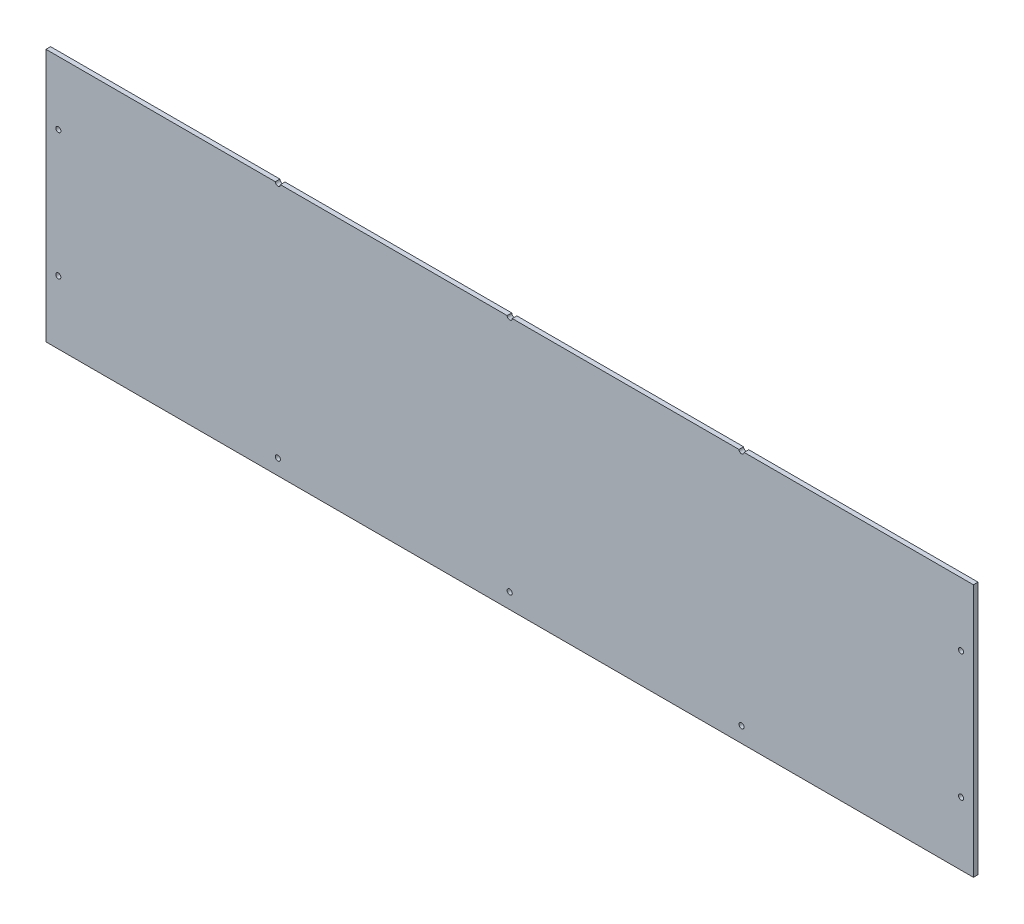
ISO-10303-21;
HEADER;
FILE_DESCRIPTION(('STEP AP214'),'2;1');
FILE_NAME('part.step','',(''),(''),'','','');
FILE_SCHEMA(('AUTOMOTIVE_DESIGN { 1 0 10303 214 1 1 1 1 }'));
ENDSEC;
DATA;
#1=APPLICATION_CONTEXT('core data for automotive mechanical design processes');
#2=APPLICATION_PROTOCOL_DEFINITION('international standard','automotive_design',2000,#1);
#3=PRODUCT_CONTEXT('',#1,'mechanical');
#4=PRODUCT('Part','Part','',(#3));
#5=PRODUCT_RELATED_PRODUCT_CATEGORY('part','',(#4));
#6=PRODUCT_DEFINITION_FORMATION('','',#4);
#7=PRODUCT_DEFINITION_CONTEXT('part definition',#1,'design');
#8=PRODUCT_DEFINITION('design','',#6,#7);
#9=PRODUCT_DEFINITION_SHAPE('','',#8);
#10=(LENGTH_UNIT() NAMED_UNIT(*) SI_UNIT(.MILLI.,.METRE.));
#11=(NAMED_UNIT(*) PLANE_ANGLE_UNIT() SI_UNIT($,.RADIAN.));
#12=(NAMED_UNIT(*) SI_UNIT($,.STERADIAN.) SOLID_ANGLE_UNIT());
#13=UNCERTAINTY_MEASURE_WITH_UNIT(LENGTH_MEASURE(1.E-05),#10,'distance_accuracy_value','');
#14=(GEOMETRIC_REPRESENTATION_CONTEXT(3) GLOBAL_UNCERTAINTY_ASSIGNED_CONTEXT((#13)) GLOBAL_UNIT_ASSIGNED_CONTEXT((#10,
#11,#12)) REPRESENTATION_CONTEXT('',''));
#15=CARTESIAN_POINT('',(0.,0.,0.));
#16=DIRECTION('',(0.,0.,1.));
#17=DIRECTION('',(1.,0.,0.));
#18=AXIS2_PLACEMENT_3D('',#15,#16,#17);
#19=CARTESIAN_POINT('',(-226.,123.499999999998,4.5));
#20=DIRECTION('',(0.,0.,1.));
#21=DIRECTION('',(1.,0.,0.));
#22=AXIS2_PLACEMENT_3D('',#19,#20,#21);
#23=PLANE('',#22);
#24=CARTESIAN_POINT('',(226.,-108.5,4.5));
#25=DIRECTION('',(0.,0.,1.));
#26=DIRECTION('',(1.,0.,0.));
#27=AXIS2_PLACEMENT_3D('',#24,#25,#26);
#28=CIRCLE('',#27,2.5);
#29=CARTESIAN_POINT('',(228.5,-108.5,4.5));
#30=VERTEX_POINT('',#29);
#31=EDGE_CURVE('E281',#30,#30,#28,.T.);
#32=ORIENTED_EDGE('',*,*,#31,.F.);
#33=EDGE_LOOP('',(#32));
#34=FACE_BOUND('',#33,.T.);
#35=CARTESIAN_POINT('',(440.,61.7500000000001,4.5));
#36=DIRECTION('',(0.,0.,1.));
#37=DIRECTION('',(-1.,0.,0.));
#38=AXIS2_PLACEMENT_3D('',#35,#36,#37);
#39=CIRCLE('',#38,2.50000000000002);
#40=CARTESIAN_POINT('',(437.5,61.7500000000001,4.5));
#41=VERTEX_POINT('',#40);
#42=EDGE_CURVE('E265',#41,#41,#39,.T.);
#43=ORIENTED_EDGE('',*,*,#42,.F.);
#44=EDGE_LOOP('',(#43));
#45=FACE_BOUND('',#44,.T.);
#46=CARTESIAN_POINT('',(439.999999999999,-61.7499999999999,4.5));
#47=DIRECTION('',(0.,0.,1.));
#48=DIRECTION('',(-1.,0.,0.));
#49=AXIS2_PLACEMENT_3D('',#46,#47,#48);
#50=CIRCLE('',#49,2.50000000000002);
#51=CARTESIAN_POINT('',(437.499999999999,-61.7499999999999,4.5));
#52=VERTEX_POINT('',#51);
#53=EDGE_CURVE('E249',#52,#52,#50,.T.);
#54=ORIENTED_EDGE('',*,*,#53,.F.);
#55=EDGE_LOOP('',(#54));
#56=FACE_BOUND('',#55,.T.);
#57=DIRECTION('',(-1.,0.,0.));
#58=VECTOR('',#57,1.);
#59=CARTESIAN_POINT('',(-452.,123.5,4.5));
#60=LINE('',#59,#58);
#61=CARTESIAN_POINT('',(-228.5,123.499999999998,4.5));
#62=VERTEX_POINT('',#61);
#63=CARTESIAN_POINT('',(-452.,123.5,4.5));
#64=VERTEX_POINT('',#63);
#65=EDGE_CURVE('E182',#62,#64,#60,.T.);
#66=ORIENTED_EDGE('',*,*,#65,.T.);
#67=DIRECTION('',(0.,-1.,0.));
#68=VECTOR('',#67,1.);
#69=CARTESIAN_POINT('',(-452.,123.5,4.5));
#70=LINE('',#69,#68);
#71=CARTESIAN_POINT('',(-452.,-123.5,4.5));
#72=VERTEX_POINT('',#71);
#73=EDGE_CURVE('E106',#64,#72,#70,.T.);
#74=ORIENTED_EDGE('',*,*,#73,.T.);
#75=DIRECTION('',(1.,0.,0.));
#76=VECTOR('',#75,1.);
#77=CARTESIAN_POINT('',(-452.,-123.5,4.5));
#78=LINE('',#77,#76);
#79=CARTESIAN_POINT('',(452.,-123.5,4.5));
#80=VERTEX_POINT('',#79);
#81=EDGE_CURVE('E211',#72,#80,#78,.T.);
#82=ORIENTED_EDGE('',*,*,#81,.T.);
#83=DIRECTION('',(0.,1.,0.));
#84=VECTOR('',#83,1.);
#85=CARTESIAN_POINT('',(452.,123.5,4.5));
#86=LINE('',#85,#84);
#87=CARTESIAN_POINT('',(452.,123.5,4.5));
#88=VERTEX_POINT('',#87);
#89=EDGE_CURVE('E231',#80,#88,#86,.T.);
#90=ORIENTED_EDGE('',*,*,#89,.T.);
#91=DIRECTION('',(-1.,0.,0.));
#92=VECTOR('',#91,1.);
#93=CARTESIAN_POINT('',(228.5,123.5,4.5));
#94=LINE('',#93,#92);
#95=CARTESIAN_POINT('',(228.5,123.5,4.5));
#96=VERTEX_POINT('',#95);
#97=EDGE_CURVE('E227',#88,#96,#94,.T.);
#98=ORIENTED_EDGE('',*,*,#97,.T.);
#99=CARTESIAN_POINT('',(226.,123.5,4.5));
#100=DIRECTION('',(0.,0.,-1.));
#101=DIRECTION('',(1.,0.,0.));
#102=AXIS2_PLACEMENT_3D('',#99,#100,#101);
#103=CIRCLE('',#102,2.5);
#104=CARTESIAN_POINT('',(223.5,123.5,4.5));
#105=VERTEX_POINT('',#104);
#106=EDGE_CURVE('E230',#96,#105,#103,.T.);
#107=ORIENTED_EDGE('',*,*,#106,.T.);
#108=DIRECTION('',(-1.,0.,0.));
#109=VECTOR('',#108,1.);
#110=CARTESIAN_POINT('',(2.50000000000006,123.5,4.5));
#111=LINE('',#110,#109);
#112=CARTESIAN_POINT('',(2.50000000000006,123.5,4.5));
#113=VERTEX_POINT('',#112);
#114=EDGE_CURVE('E131',#105,#113,#111,.T.);
#115=ORIENTED_EDGE('',*,*,#114,.T.);
#116=CARTESIAN_POINT('',(0.,123.5,4.5));
#117=DIRECTION('',(0.,0.,-1.));
#118=DIRECTION('',(1.,0.,0.));
#119=AXIS2_PLACEMENT_3D('',#116,#117,#118);
#120=CIRCLE('',#119,2.5);
#121=CARTESIAN_POINT('',(-2.49999999999995,123.5,4.5));
#122=VERTEX_POINT('',#121);
#123=EDGE_CURVE('E125',#113,#122,#120,.T.);
#124=ORIENTED_EDGE('',*,*,#123,.T.);
#125=DIRECTION('',(-1.,0.,0.));
#126=VECTOR('',#125,1.);
#127=CARTESIAN_POINT('',(-223.5,123.499999999998,4.5));
#128=LINE('',#127,#126);
#129=CARTESIAN_POINT('',(-223.5,123.499999999998,4.5));
#130=VERTEX_POINT('',#129);
#131=EDGE_CURVE('E129',#122,#130,#128,.T.);
#132=ORIENTED_EDGE('',*,*,#131,.T.);
#133=CARTESIAN_POINT('',(-226.,123.499999999998,4.5));
#134=DIRECTION('',(0.,0.,-1.));
#135=DIRECTION('',(1.,0.,0.));
#136=AXIS2_PLACEMENT_3D('',#133,#134,#135);
#137=CIRCLE('',#136,2.5);
#138=EDGE_CURVE('E57',#130,#62,#137,.T.);
#139=ORIENTED_EDGE('',*,*,#138,.T.);
#140=EDGE_LOOP('',(#66,#74,#82,#90,#98,#107,#115,#124,#132,#139));
#141=FACE_BOUND('',#140,.T.);
#142=CARTESIAN_POINT('',(-440.,61.7500000000001,4.5));
#143=DIRECTION('',(0.,0.,1.));
#144=DIRECTION('',(1.,0.,0.));
#145=AXIS2_PLACEMENT_3D('',#142,#143,#144);
#146=CIRCLE('',#145,2.50000000000002);
#147=CARTESIAN_POINT('',(-437.5,61.7500000000001,4.5));
#148=VERTEX_POINT('',#147);
#149=EDGE_CURVE('E158',#148,#148,#146,.T.);
#150=ORIENTED_EDGE('',*,*,#149,.F.);
#151=EDGE_LOOP('',(#150));
#152=FACE_BOUND('',#151,.T.);
#153=CARTESIAN_POINT('',(-439.999999999999,-61.7499999999999,4.5));
#154=DIRECTION('',(0.,0.,1.));
#155=DIRECTION('',(1.,0.,0.));
#156=AXIS2_PLACEMENT_3D('',#153,#154,#155);
#157=CIRCLE('',#156,2.50000000000002);
#158=CARTESIAN_POINT('',(-437.499999999999,-61.7499999999999,4.5));
#159=VERTEX_POINT('',#158);
#160=EDGE_CURVE('E257',#159,#159,#157,.T.);
#161=ORIENTED_EDGE('',*,*,#160,.F.);
#162=EDGE_LOOP('',(#161));
#163=FACE_BOUND('',#162,.T.);
#164=CARTESIAN_POINT('',(0.,-108.5,4.5));
#165=DIRECTION('',(0.,0.,1.));
#166=DIRECTION('',(1.,0.,0.));
#167=AXIS2_PLACEMENT_3D('',#164,#165,#166);
#168=CIRCLE('',#167,2.5);
#169=CARTESIAN_POINT('',(2.50000000000005,-108.5,4.5));
#170=VERTEX_POINT('',#169);
#171=EDGE_CURVE('E273',#170,#170,#168,.T.);
#172=ORIENTED_EDGE('',*,*,#171,.F.);
#173=EDGE_LOOP('',(#172));
#174=FACE_BOUND('',#173,.T.);
#175=CARTESIAN_POINT('',(-226.,-108.500000000001,4.5));
#176=DIRECTION('',(0.,0.,1.));
#177=DIRECTION('',(1.,0.,0.));
#178=AXIS2_PLACEMENT_3D('',#175,#176,#177);
#179=CIRCLE('',#178,2.5);
#180=CARTESIAN_POINT('',(-223.5,-108.500000000001,4.5));
#181=VERTEX_POINT('',#180);
#182=EDGE_CURVE('E289',#181,#181,#179,.T.);
#183=ORIENTED_EDGE('',*,*,#182,.F.);
#184=EDGE_LOOP('',(#183));
#185=FACE_BOUND('',#184,.T.);
#186=ADVANCED_FACE('F39',(#34,#45,#56,#141,#152,#163,#174,#185),#23,.T.);
#187=CARTESIAN_POINT('',(-226.,123.499999999998,0.));
#188=DIRECTION('',(0.,0.,1.));
#189=DIRECTION('',(1.,0.,0.));
#190=AXIS2_PLACEMENT_3D('',#187,#188,#189);
#191=PLANE('',#190);
#192=DIRECTION('',(-1.,0.,0.));
#193=VECTOR('',#192,1.);
#194=CARTESIAN_POINT('',(-452.,123.5,0.));
#195=LINE('',#194,#193);
#196=CARTESIAN_POINT('',(-228.5,123.499999999998,0.));
#197=VERTEX_POINT('',#196);
#198=CARTESIAN_POINT('',(-452.,123.5,0.));
#199=VERTEX_POINT('',#198);
#200=EDGE_CURVE('E153',#197,#199,#195,.T.);
#201=ORIENTED_EDGE('',*,*,#200,.F.);
#202=CARTESIAN_POINT('',(-226.,123.499999999998,0.));
#203=DIRECTION('',(0.,0.,-1.));
#204=DIRECTION('',(1.,0.,0.));
#205=AXIS2_PLACEMENT_3D('',#202,#203,#204);
#206=CIRCLE('',#205,2.5);
#207=CARTESIAN_POINT('',(-223.5,123.499999999998,0.));
#208=VERTEX_POINT('',#207);
#209=EDGE_CURVE('E98',#208,#197,#206,.T.);
#210=ORIENTED_EDGE('',*,*,#209,.F.);
#211=DIRECTION('',(-1.,0.,0.));
#212=VECTOR('',#211,1.);
#213=CARTESIAN_POINT('',(-223.5,123.499999999998,0.));
#214=LINE('',#213,#212);
#215=CARTESIAN_POINT('',(-2.49999999999995,123.5,0.));
#216=VERTEX_POINT('',#215);
#217=EDGE_CURVE('E92',#216,#208,#214,.T.);
#218=ORIENTED_EDGE('',*,*,#217,.F.);
#219=CARTESIAN_POINT('',(0.,123.5,0.));
#220=DIRECTION('',(0.,0.,-1.));
#221=DIRECTION('',(1.,0.,0.));
#222=AXIS2_PLACEMENT_3D('',#219,#220,#221);
#223=CIRCLE('',#222,2.5);
#224=CARTESIAN_POINT('',(2.50000000000006,123.5,0.));
#225=VERTEX_POINT('',#224);
#226=EDGE_CURVE('E140',#225,#216,#223,.T.);
#227=ORIENTED_EDGE('',*,*,#226,.F.);
#228=DIRECTION('',(-1.,0.,0.));
#229=VECTOR('',#228,1.);
#230=CARTESIAN_POINT('',(2.50000000000006,123.5,0.));
#231=LINE('',#230,#229);
#232=CARTESIAN_POINT('',(223.5,123.5,0.));
#233=VERTEX_POINT('',#232);
#234=EDGE_CURVE('E173',#233,#225,#231,.T.);
#235=ORIENTED_EDGE('',*,*,#234,.F.);
#236=CARTESIAN_POINT('',(226.,123.5,0.));
#237=DIRECTION('',(0.,0.,-1.));
#238=DIRECTION('',(1.,0.,0.));
#239=AXIS2_PLACEMENT_3D('',#236,#237,#238);
#240=CIRCLE('',#239,2.5);
#241=CARTESIAN_POINT('',(228.5,123.5,0.));
#242=VERTEX_POINT('',#241);
#243=EDGE_CURVE('E170',#242,#233,#240,.T.);
#244=ORIENTED_EDGE('',*,*,#243,.F.);
#245=DIRECTION('',(-1.,0.,0.));
#246=VECTOR('',#245,1.);
#247=CARTESIAN_POINT('',(228.5,123.5,0.));
#248=LINE('',#247,#246);
#249=CARTESIAN_POINT('',(452.,123.5,0.));
#250=VERTEX_POINT('',#249);
#251=EDGE_CURVE('E167',#250,#242,#248,.T.);
#252=ORIENTED_EDGE('',*,*,#251,.F.);
#253=DIRECTION('',(0.,1.,0.));
#254=VECTOR('',#253,1.);
#255=CARTESIAN_POINT('',(452.,123.5,0.));
#256=LINE('',#255,#254);
#257=CARTESIAN_POINT('',(452.,-123.5,0.));
#258=VERTEX_POINT('',#257);
#259=EDGE_CURVE('E164',#258,#250,#256,.T.);
#260=ORIENTED_EDGE('',*,*,#259,.F.);
#261=DIRECTION('',(1.,0.,0.));
#262=VECTOR('',#261,1.);
#263=CARTESIAN_POINT('',(-452.,-123.5,0.));
#264=LINE('',#263,#262);
#265=CARTESIAN_POINT('',(-452.,-123.5,0.));
#266=VERTEX_POINT('',#265);
#267=EDGE_CURVE('E161',#266,#258,#264,.T.);
#268=ORIENTED_EDGE('',*,*,#267,.F.);
#269=DIRECTION('',(0.,-1.,0.));
#270=VECTOR('',#269,1.);
#271=CARTESIAN_POINT('',(-452.,123.5,0.));
#272=LINE('',#271,#270);
#273=EDGE_CURVE('E157',#199,#266,#272,.T.);
#274=ORIENTED_EDGE('',*,*,#273,.F.);
#275=EDGE_LOOP('',(#201,#210,#218,#227,#235,#244,#252,#260,#268,#274));
#276=FACE_BOUND('',#275,.T.);
#277=CARTESIAN_POINT('',(-440.,61.7500000000001,0.));
#278=DIRECTION('',(0.,0.,1.));
#279=DIRECTION('',(1.,0.,0.));
#280=AXIS2_PLACEMENT_3D('',#277,#278,#279);
#281=CIRCLE('',#280,2.50000000000002);
#282=CARTESIAN_POINT('',(-437.5,61.7500000000001,0.));
#283=VERTEX_POINT('',#282);
#284=EDGE_CURVE('E245',#283,#283,#281,.T.);
#285=ORIENTED_EDGE('',*,*,#284,.T.);
#286=EDGE_LOOP('',(#285));
#287=FACE_BOUND('',#286,.T.);
#288=CARTESIAN_POINT('',(439.999999999999,-61.7499999999999,0.));
#289=DIRECTION('',(0.,0.,1.));
#290=DIRECTION('',(-1.,0.,0.));
#291=AXIS2_PLACEMENT_3D('',#288,#289,#290);
#292=CIRCLE('',#291,2.50000000000002);
#293=CARTESIAN_POINT('',(437.499999999999,-61.7499999999999,0.));
#294=VERTEX_POINT('',#293);
#295=EDGE_CURVE('E253',#294,#294,#292,.T.);
#296=ORIENTED_EDGE('',*,*,#295,.T.);
#297=EDGE_LOOP('',(#296));
#298=FACE_BOUND('',#297,.T.);
#299=CARTESIAN_POINT('',(-439.999999999999,-61.7499999999999,0.));
#300=DIRECTION('',(0.,0.,1.));
#301=DIRECTION('',(1.,0.,0.));
#302=AXIS2_PLACEMENT_3D('',#299,#300,#301);
#303=CIRCLE('',#302,2.50000000000002);
#304=CARTESIAN_POINT('',(-437.499999999999,-61.7499999999999,0.));
#305=VERTEX_POINT('',#304);
#306=EDGE_CURVE('E261',#305,#305,#303,.T.);
#307=ORIENTED_EDGE('',*,*,#306,.T.);
#308=EDGE_LOOP('',(#307));
#309=FACE_BOUND('',#308,.T.);
#310=CARTESIAN_POINT('',(440.,61.7500000000001,0.));
#311=DIRECTION('',(0.,0.,1.));
#312=DIRECTION('',(-1.,0.,0.));
#313=AXIS2_PLACEMENT_3D('',#310,#311,#312);
#314=CIRCLE('',#313,2.50000000000002);
#315=CARTESIAN_POINT('',(437.5,61.7500000000001,0.));
#316=VERTEX_POINT('',#315);
#317=EDGE_CURVE('E269',#316,#316,#314,.T.);
#318=ORIENTED_EDGE('',*,*,#317,.T.);
#319=EDGE_LOOP('',(#318));
#320=FACE_BOUND('',#319,.T.);
#321=CARTESIAN_POINT('',(0.,-108.5,0.));
#322=DIRECTION('',(0.,0.,1.));
#323=DIRECTION('',(1.,0.,0.));
#324=AXIS2_PLACEMENT_3D('',#321,#322,#323);
#325=CIRCLE('',#324,2.5);
#326=CARTESIAN_POINT('',(2.50000000000005,-108.5,0.));
#327=VERTEX_POINT('',#326);
#328=EDGE_CURVE('E277',#327,#327,#325,.T.);
#329=ORIENTED_EDGE('',*,*,#328,.T.);
#330=EDGE_LOOP('',(#329));
#331=FACE_BOUND('',#330,.T.);
#332=CARTESIAN_POINT('',(226.,-108.5,0.));
#333=DIRECTION('',(0.,0.,1.));
#334=DIRECTION('',(1.,0.,0.));
#335=AXIS2_PLACEMENT_3D('',#332,#333,#334);
#336=CIRCLE('',#335,2.5);
#337=CARTESIAN_POINT('',(228.5,-108.5,0.));
#338=VERTEX_POINT('',#337);
#339=EDGE_CURVE('E285',#338,#338,#336,.T.);
#340=ORIENTED_EDGE('',*,*,#339,.T.);
#341=EDGE_LOOP('',(#340));
#342=FACE_BOUND('',#341,.T.);
#343=CARTESIAN_POINT('',(-226.,-108.500000000001,0.));
#344=DIRECTION('',(0.,0.,1.));
#345=DIRECTION('',(1.,0.,0.));
#346=AXIS2_PLACEMENT_3D('',#343,#344,#345);
#347=CIRCLE('',#346,2.5);
#348=CARTESIAN_POINT('',(-223.5,-108.500000000001,0.));
#349=VERTEX_POINT('',#348);
#350=EDGE_CURVE('E293',#349,#349,#347,.T.);
#351=ORIENTED_EDGE('',*,*,#350,.T.);
#352=EDGE_LOOP('',(#351));
#353=FACE_BOUND('',#352,.T.);
#354=ADVANCED_FACE('F215',(#276,#287,#298,#309,#320,#331,#342,#353),#191,.F.);
#355=CARTESIAN_POINT('',(-452.,123.5,4.5));
#356=DIRECTION('',(0.,-1.,0.));
#357=DIRECTION('',(1.,0.,0.));
#358=AXIS2_PLACEMENT_3D('',#355,#356,#357);
#359=PLANE('',#358);
#360=ORIENTED_EDGE('',*,*,#200,.T.);
#361=DIRECTION('',(0.,0.,-1.));
#362=VECTOR('',#361,1.);
#363=CARTESIAN_POINT('',(-452.,123.5,4.5));
#364=LINE('',#363,#362);
#365=EDGE_CURVE('E11',#64,#199,#364,.T.);
#366=ORIENTED_EDGE('',*,*,#365,.F.);
#367=ORIENTED_EDGE('',*,*,#65,.F.);
#368=DIRECTION('',(0.,0.,-1.));
#369=VECTOR('',#368,1.);
#370=CARTESIAN_POINT('',(-228.5,123.499999999998,4.5));
#371=LINE('',#370,#369);
#372=EDGE_CURVE('E149',#62,#197,#371,.T.);
#373=ORIENTED_EDGE('',*,*,#372,.T.);
#374=EDGE_LOOP('',(#360,#366,#367,#373));
#375=FACE_BOUND('',#374,.T.);
#376=ADVANCED_FACE('F41',(#375),#359,.F.);
#377=CARTESIAN_POINT('',(-452.,123.5,4.5));
#378=DIRECTION('',(1.,0.,0.));
#379=DIRECTION('',(0.,0.,-1.));
#380=AXIS2_PLACEMENT_3D('',#377,#378,#379);
#381=PLANE('',#380);
#382=ORIENTED_EDGE('',*,*,#273,.T.);
#383=DIRECTION('',(0.,0.,-1.));
#384=VECTOR('',#383,1.);
#385=CARTESIAN_POINT('',(-452.,-123.5,4.5));
#386=LINE('',#385,#384);
#387=EDGE_CURVE('E49',#72,#266,#386,.T.);
#388=ORIENTED_EDGE('',*,*,#387,.F.);
#389=ORIENTED_EDGE('',*,*,#73,.F.);
#390=ORIENTED_EDGE('',*,*,#365,.T.);
#391=EDGE_LOOP('',(#382,#388,#389,#390));
#392=FACE_BOUND('',#391,.T.);
#393=ADVANCED_FACE('F337',(#392),#381,.F.);
#394=CARTESIAN_POINT('',(-452.,-123.5,4.5));
#395=DIRECTION('',(0.,1.,0.));
#396=DIRECTION('',(-1.,0.,0.));
#397=AXIS2_PLACEMENT_3D('',#394,#395,#396);
#398=PLANE('',#397);
#399=ORIENTED_EDGE('',*,*,#267,.T.);
#400=DIRECTION('',(0.,0.,-1.));
#401=VECTOR('',#400,1.);
#402=CARTESIAN_POINT('',(452.,-123.5,4.5));
#403=LINE('',#402,#401);
#404=EDGE_CURVE('E201',#80,#258,#403,.T.);
#405=ORIENTED_EDGE('',*,*,#404,.F.);
#406=ORIENTED_EDGE('',*,*,#81,.F.);
#407=ORIENTED_EDGE('',*,*,#387,.T.);
#408=EDGE_LOOP('',(#399,#405,#406,#407));
#409=FACE_BOUND('',#408,.T.);
#410=ADVANCED_FACE('F209',(#409),#398,.F.);
#411=CARTESIAN_POINT('',(452.,123.5,4.5));
#412=DIRECTION('',(-1.,0.,0.));
#413=DIRECTION('',(0.,0.,1.));
#414=AXIS2_PLACEMENT_3D('',#411,#412,#413);
#415=PLANE('',#414);
#416=ORIENTED_EDGE('',*,*,#259,.T.);
#417=DIRECTION('',(0.,0.,-1.));
#418=VECTOR('',#417,1.);
#419=CARTESIAN_POINT('',(452.,123.5,4.5));
#420=LINE('',#419,#418);
#421=EDGE_CURVE('E197',#88,#250,#420,.T.);
#422=ORIENTED_EDGE('',*,*,#421,.F.);
#423=ORIENTED_EDGE('',*,*,#89,.F.);
#424=ORIENTED_EDGE('',*,*,#404,.T.);
#425=EDGE_LOOP('',(#416,#422,#423,#424));
#426=FACE_BOUND('',#425,.T.);
#427=ADVANCED_FACE('F221',(#426),#415,.F.);
#428=CARTESIAN_POINT('',(228.5,123.5,4.5));
#429=DIRECTION('',(0.,-1.,0.));
#430=DIRECTION('',(1.,0.,0.));
#431=AXIS2_PLACEMENT_3D('',#428,#429,#430);
#432=PLANE('',#431);
#433=ORIENTED_EDGE('',*,*,#251,.T.);
#434=DIRECTION('',(0.,0.,-1.));
#435=VECTOR('',#434,1.);
#436=CARTESIAN_POINT('',(228.5,123.5,4.5));
#437=LINE('',#436,#435);
#438=EDGE_CURVE('E193',#96,#242,#437,.T.);
#439=ORIENTED_EDGE('',*,*,#438,.F.);
#440=ORIENTED_EDGE('',*,*,#97,.F.);
#441=ORIENTED_EDGE('',*,*,#421,.T.);
#442=EDGE_LOOP('',(#433,#439,#440,#441));
#443=FACE_BOUND('',#442,.T.);
#444=ADVANCED_FACE('F225',(#443),#432,.F.);
#445=CARTESIAN_POINT('',(226.,123.5,4.5));
#446=DIRECTION('',(0.,0.,-1.));
#447=DIRECTION('',(-1.,0.,0.));
#448=AXIS2_PLACEMENT_3D('',#445,#446,#447);
#449=CYLINDRICAL_SURFACE('',#448,2.5);
#450=ORIENTED_EDGE('',*,*,#243,.T.);
#451=DIRECTION('',(0.,0.,-1.));
#452=VECTOR('',#451,1.);
#453=CARTESIAN_POINT('',(223.5,123.5,4.5));
#454=LINE('',#453,#452);
#455=EDGE_CURVE('E189',#105,#233,#454,.T.);
#456=ORIENTED_EDGE('',*,*,#455,.F.);
#457=ORIENTED_EDGE('',*,*,#106,.F.);
#458=ORIENTED_EDGE('',*,*,#438,.T.);
#459=EDGE_LOOP('',(#450,#456,#457,#458));
#460=FACE_BOUND('',#459,.T.);
#461=ADVANCED_FACE('F327',(#460),#449,.F.);
#462=CARTESIAN_POINT('',(2.50000000000006,123.5,4.5));
#463=DIRECTION('',(0.,-1.,0.));
#464=DIRECTION('',(0.,0.,-1.));
#465=AXIS2_PLACEMENT_3D('',#462,#463,#464);
#466=PLANE('',#465);
#467=ORIENTED_EDGE('',*,*,#234,.T.);
#468=DIRECTION('',(0.,0.,-1.));
#469=VECTOR('',#468,1.);
#470=CARTESIAN_POINT('',(2.50000000000006,123.5,4.5));
#471=LINE('',#470,#469);
#472=EDGE_CURVE('E142',#113,#225,#471,.T.);
#473=ORIENTED_EDGE('',*,*,#472,.F.);
#474=ORIENTED_EDGE('',*,*,#114,.F.);
#475=ORIENTED_EDGE('',*,*,#455,.T.);
#476=EDGE_LOOP('',(#467,#473,#474,#475));
#477=FACE_BOUND('',#476,.T.);
#478=ADVANCED_FACE('F324',(#477),#466,.F.);
#479=CARTESIAN_POINT('',(0.,123.5,4.5));
#480=DIRECTION('',(0.,0.,-1.));
#481=DIRECTION('',(-1.,0.,0.));
#482=AXIS2_PLACEMENT_3D('',#479,#480,#481);
#483=CYLINDRICAL_SURFACE('',#482,2.5);
#484=ORIENTED_EDGE('',*,*,#226,.T.);
#485=DIRECTION('',(0.,0.,-1.));
#486=VECTOR('',#485,1.);
#487=CARTESIAN_POINT('',(-2.49999999999995,123.5,4.5));
#488=LINE('',#487,#486);
#489=EDGE_CURVE('E137',#122,#216,#488,.T.);
#490=ORIENTED_EDGE('',*,*,#489,.F.);
#491=ORIENTED_EDGE('',*,*,#123,.F.);
#492=ORIENTED_EDGE('',*,*,#472,.T.);
#493=EDGE_LOOP('',(#484,#490,#491,#492));
#494=FACE_BOUND('',#493,.T.);
#495=ADVANCED_FACE('F138',(#494),#483,.F.);
#496=CARTESIAN_POINT('',(-223.5,123.499999999998,4.5));
#497=DIRECTION('',(0.,-1.,0.));
#498=DIRECTION('',(1.,0.,0.));
#499=AXIS2_PLACEMENT_3D('',#496,#497,#498);
#500=PLANE('',#499);
#501=ORIENTED_EDGE('',*,*,#217,.T.);
#502=DIRECTION('',(0.,0.,-1.));
#503=VECTOR('',#502,1.);
#504=CARTESIAN_POINT('',(-223.5,123.499999999998,4.5));
#505=LINE('',#504,#503);
#506=EDGE_CURVE('E143',#130,#208,#505,.T.);
#507=ORIENTED_EDGE('',*,*,#506,.F.);
#508=ORIENTED_EDGE('',*,*,#131,.F.);
#509=ORIENTED_EDGE('',*,*,#489,.T.);
#510=EDGE_LOOP('',(#501,#507,#508,#509));
#511=FACE_BOUND('',#510,.T.);
#512=ADVANCED_FACE('F145',(#511),#500,.F.);
#513=CARTESIAN_POINT('',(-226.,123.499999999998,4.5));
#514=DIRECTION('',(0.,0.,-1.));
#515=DIRECTION('',(-1.,0.,0.));
#516=AXIS2_PLACEMENT_3D('',#513,#514,#515);
#517=CYLINDRICAL_SURFACE('',#516,2.5);
#518=ORIENTED_EDGE('',*,*,#209,.T.);
#519=ORIENTED_EDGE('',*,*,#372,.F.);
#520=ORIENTED_EDGE('',*,*,#138,.F.);
#521=ORIENTED_EDGE('',*,*,#506,.T.);
#522=EDGE_LOOP('',(#518,#519,#520,#521));
#523=FACE_BOUND('',#522,.T.);
#524=ADVANCED_FACE('F317',(#523),#517,.F.);
#525=CARTESIAN_POINT('',(-440.,61.7500000000001,4.5));
#526=DIRECTION('',(0.,0.,-1.));
#527=DIRECTION('',(-1.,0.,0.));
#528=AXIS2_PLACEMENT_3D('',#525,#526,#527);
#529=CYLINDRICAL_SURFACE('',#528,2.50000000000002);
#530=ORIENTED_EDGE('',*,*,#149,.T.);
#531=EDGE_LOOP('',(#530));
#532=FACE_BOUND('',#531,.T.);
#533=ORIENTED_EDGE('',*,*,#284,.F.);
#534=EDGE_LOOP('',(#533));
#535=FACE_BOUND('',#534,.T.);
#536=ADVANCED_FACE('F314',(#532,#535),#529,.F.);
#537=CARTESIAN_POINT('',(439.999999999999,-61.7499999999999,4.5));
#538=DIRECTION('',(0.,0.,-1.));
#539=DIRECTION('',(-1.,0.,0.));
#540=AXIS2_PLACEMENT_3D('',#537,#538,#539);
#541=CYLINDRICAL_SURFACE('',#540,2.50000000000002);
#542=ORIENTED_EDGE('',*,*,#53,.T.);
#543=EDGE_LOOP('',(#542));
#544=FACE_BOUND('',#543,.T.);
#545=ORIENTED_EDGE('',*,*,#295,.F.);
#546=EDGE_LOOP('',(#545));
#547=FACE_BOUND('',#546,.T.);
#548=ADVANCED_FACE('F413',(#544,#547),#541,.F.);
#549=CARTESIAN_POINT('',(-439.999999999999,-61.7499999999999,4.5));
#550=DIRECTION('',(0.,0.,-1.));
#551=DIRECTION('',(-1.,0.,0.));
#552=AXIS2_PLACEMENT_3D('',#549,#550,#551);
#553=CYLINDRICAL_SURFACE('',#552,2.50000000000002);
#554=ORIENTED_EDGE('',*,*,#160,.T.);
#555=EDGE_LOOP('',(#554));
#556=FACE_BOUND('',#555,.T.);
#557=ORIENTED_EDGE('',*,*,#306,.F.);
#558=EDGE_LOOP('',(#557));
#559=FACE_BOUND('',#558,.T.);
#560=ADVANCED_FACE('F421',(#556,#559),#553,.F.);
#561=CARTESIAN_POINT('',(440.,61.7500000000001,4.5));
#562=DIRECTION('',(0.,0.,-1.));
#563=DIRECTION('',(-1.,0.,0.));
#564=AXIS2_PLACEMENT_3D('',#561,#562,#563);
#565=CYLINDRICAL_SURFACE('',#564,2.50000000000002);
#566=ORIENTED_EDGE('',*,*,#42,.T.);
#567=EDGE_LOOP('',(#566));
#568=FACE_BOUND('',#567,.T.);
#569=ORIENTED_EDGE('',*,*,#317,.F.);
#570=EDGE_LOOP('',(#569));
#571=FACE_BOUND('',#570,.T.);
#572=ADVANCED_FACE('F429',(#568,#571),#565,.F.);
#573=CARTESIAN_POINT('',(0.,-108.5,4.5));
#574=DIRECTION('',(0.,0.,-1.));
#575=DIRECTION('',(-1.,0.,0.));
#576=AXIS2_PLACEMENT_3D('',#573,#574,#575);
#577=CYLINDRICAL_SURFACE('',#576,2.5);
#578=ORIENTED_EDGE('',*,*,#171,.T.);
#579=EDGE_LOOP('',(#578));
#580=FACE_BOUND('',#579,.T.);
#581=ORIENTED_EDGE('',*,*,#328,.F.);
#582=EDGE_LOOP('',(#581));
#583=FACE_BOUND('',#582,.T.);
#584=ADVANCED_FACE('F438',(#580,#583),#577,.F.);
#585=CARTESIAN_POINT('',(226.,-108.5,4.5));
#586=DIRECTION('',(0.,0.,-1.));
#587=DIRECTION('',(-1.,0.,0.));
#588=AXIS2_PLACEMENT_3D('',#585,#586,#587);
#589=CYLINDRICAL_SURFACE('',#588,2.5);
#590=ORIENTED_EDGE('',*,*,#31,.T.);
#591=EDGE_LOOP('',(#590));
#592=FACE_BOUND('',#591,.T.);
#593=ORIENTED_EDGE('',*,*,#339,.F.);
#594=EDGE_LOOP('',(#593));
#595=FACE_BOUND('',#594,.T.);
#596=ADVANCED_FACE('F447',(#592,#595),#589,.F.);
#597=CARTESIAN_POINT('',(-226.,-108.500000000001,4.5));
#598=DIRECTION('',(0.,0.,-1.));
#599=DIRECTION('',(-1.,0.,0.));
#600=AXIS2_PLACEMENT_3D('',#597,#598,#599);
#601=CYLINDRICAL_SURFACE('',#600,2.5);
#602=ORIENTED_EDGE('',*,*,#182,.T.);
#603=EDGE_LOOP('',(#602));
#604=FACE_BOUND('',#603,.T.);
#605=ORIENTED_EDGE('',*,*,#350,.F.);
#606=EDGE_LOOP('',(#605));
#607=FACE_BOUND('',#606,.T.);
#608=ADVANCED_FACE('F301',(#604,#607),#601,.F.);
#609=CLOSED_SHELL('',(#186,#354,#376,#393,#410,#427,#444,#461,#478,#495,#512,#524,#536,#548,
#560,#572,#584,#596,#608));
#610=MANIFOLD_SOLID_BREP('B2',#609);
#611=ADVANCED_BREP_SHAPE_REPRESENTATION('',(#18,#610),#14);
#612=SHAPE_DEFINITION_REPRESENTATION(#9,#611);
ENDSEC;
END-ISO-10303-21;
